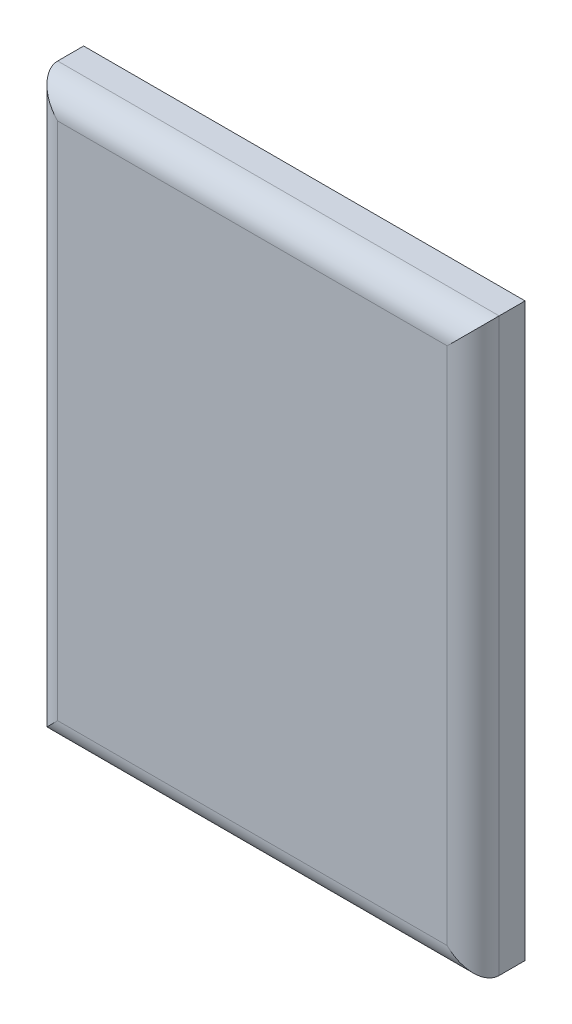
ISO-10303-21;
HEADER;
FILE_DESCRIPTION(('STEP AP214'),'2;1');
FILE_NAME('part.step','',(''),(''),'','','');
FILE_SCHEMA(('AUTOMOTIVE_DESIGN { 1 0 10303 214 1 1 1 1 }'));
ENDSEC;
DATA;
#1=APPLICATION_CONTEXT('core data for automotive mechanical design processes');
#2=APPLICATION_PROTOCOL_DEFINITION('international standard','automotive_design',2000,#1);
#3=PRODUCT_CONTEXT('',#1,'mechanical');
#4=PRODUCT('Part','Part','',(#3));
#5=PRODUCT_RELATED_PRODUCT_CATEGORY('part','',(#4));
#6=PRODUCT_DEFINITION_FORMATION('','',#4);
#7=PRODUCT_DEFINITION_CONTEXT('part definition',#1,'design');
#8=PRODUCT_DEFINITION('design','',#6,#7);
#9=PRODUCT_DEFINITION_SHAPE('','',#8);
#10=(LENGTH_UNIT() NAMED_UNIT(*) SI_UNIT(.MILLI.,.METRE.));
#11=(NAMED_UNIT(*) PLANE_ANGLE_UNIT() SI_UNIT($,.RADIAN.));
#12=(NAMED_UNIT(*) SI_UNIT($,.STERADIAN.) SOLID_ANGLE_UNIT());
#13=UNCERTAINTY_MEASURE_WITH_UNIT(LENGTH_MEASURE(1.E-05),#10,'distance_accuracy_value','');
#14=(GEOMETRIC_REPRESENTATION_CONTEXT(3) GLOBAL_UNCERTAINTY_ASSIGNED_CONTEXT((#13)) GLOBAL_UNIT_ASSIGNED_CONTEXT((#10,
#11,#12)) REPRESENTATION_CONTEXT('',''));
#15=CARTESIAN_POINT('',(0.,0.,0.));
#16=DIRECTION('',(0.,0.,1.));
#17=DIRECTION('',(1.,0.,0.));
#18=AXIS2_PLACEMENT_3D('',#15,#16,#17);
#19=CARTESIAN_POINT('',(-51.3297872340426,189.813829787234,50.));
#20=DIRECTION('',(1.,0.,0.));
#21=DIRECTION('',(0.,1.,0.));
#22=AXIS2_PLACEMENT_3D('',#19,#20,#21);
#23=PLANE('',#22);
#24=DIRECTION('',(0.,-1.,0.));
#25=VECTOR('',#24,1.);
#26=CARTESIAN_POINT('',(-51.3297872340426,189.813829787234,30.));
#27=LINE('',#26,#25);
#28=CARTESIAN_POINT('',(-51.3297872340426,189.813829787234,30.));
#29=VERTEX_POINT('',#28);
#30=CARTESIAN_POINT('',(-51.3297872340426,-30.186170212766,30.));
#31=VERTEX_POINT('',#30);
#32=EDGE_CURVE('E65',#29,#31,#27,.T.);
#33=ORIENTED_EDGE('',*,*,#32,.T.);
#34=DIRECTION('',(0.,0.,-1.));
#35=VECTOR('',#34,1.);
#36=CARTESIAN_POINT('',(-51.3297872340426,-30.186170212766,50.));
#37=LINE('',#36,#35);
#38=CARTESIAN_POINT('',(-51.3297872340426,-30.186170212766,40.));
#39=VERTEX_POINT('',#38);
#40=EDGE_CURVE('E144',#39,#31,#37,.T.);
#41=ORIENTED_EDGE('',*,*,#40,.F.);
#42=DIRECTION('',(0.,-1.,0.));
#43=VECTOR('',#42,1.);
#44=CARTESIAN_POINT('',(-51.3297872340426,189.813829787234,40.));
#45=LINE('',#44,#43);
#46=CARTESIAN_POINT('',(-51.3297872340426,189.813829787234,40.));
#47=VERTEX_POINT('',#46);
#48=EDGE_CURVE('E11',#39,#47,#45,.F.);
#49=ORIENTED_EDGE('',*,*,#48,.T.);
#50=DIRECTION('',(0.,0.,-1.));
#51=VECTOR('',#50,1.);
#52=CARTESIAN_POINT('',(-51.3297872340426,189.813829787234,50.));
#53=LINE('',#52,#51);
#54=EDGE_CURVE('E140',#47,#29,#53,.T.);
#55=ORIENTED_EDGE('',*,*,#54,.T.);
#56=EDGE_LOOP('',(#33,#41,#49,#55));
#57=FACE_BOUND('',#56,.T.);
#58=ADVANCED_FACE('F39',(#57),#23,.F.);
#59=CARTESIAN_POINT('',(-51.3297872340426,-30.186170212766,50.));
#60=DIRECTION('',(0.,1.,0.));
#61=DIRECTION('',(-1.,0.,0.));
#62=AXIS2_PLACEMENT_3D('',#59,#60,#61);
#63=PLANE('',#62);
#64=DIRECTION('',(1.,0.,0.));
#65=VECTOR('',#64,1.);
#66=CARTESIAN_POINT('',(118.670212765957,-30.186170212766,30.));
#67=LINE('',#66,#65);
#68=CARTESIAN_POINT('',(118.670212765957,-30.186170212766,30.));
#69=VERTEX_POINT('',#68);
#70=EDGE_CURVE('E201',#31,#69,#67,.T.);
#71=ORIENTED_EDGE('',*,*,#70,.T.);
#72=DIRECTION('',(0.,0.,-1.));
#73=VECTOR('',#72,1.);
#74=CARTESIAN_POINT('',(118.670212765957,-30.186170212766,50.));
#75=LINE('',#74,#73);
#76=CARTESIAN_POINT('',(118.670212765957,-30.186170212766,40.));
#77=VERTEX_POINT('',#76);
#78=EDGE_CURVE('E132',#77,#69,#75,.T.);
#79=ORIENTED_EDGE('',*,*,#78,.F.);
#80=DIRECTION('',(1.,0.,0.));
#81=VECTOR('',#80,1.);
#82=CARTESIAN_POINT('',(-51.3297872340426,-30.186170212766,40.));
#83=LINE('',#82,#81);
#84=EDGE_CURVE('E49',#77,#39,#83,.F.);
#85=ORIENTED_EDGE('',*,*,#84,.T.);
#86=ORIENTED_EDGE('',*,*,#40,.T.);
#87=EDGE_LOOP('',(#71,#79,#85,#86));
#88=FACE_BOUND('',#87,.T.);
#89=ADVANCED_FACE('F198',(#88),#63,.F.);
#90=CARTESIAN_POINT('',(118.670212765957,189.813829787234,50.));
#91=DIRECTION('',(-1.,0.,0.));
#92=DIRECTION('',(0.,-1.,0.));
#93=AXIS2_PLACEMENT_3D('',#90,#91,#92);
#94=PLANE('',#93);
#95=DIRECTION('',(0.,1.,0.));
#96=VECTOR('',#95,1.);
#97=CARTESIAN_POINT('',(118.670212765957,189.813829787234,30.));
#98=LINE('',#97,#96);
#99=CARTESIAN_POINT('',(118.670212765957,189.813829787234,30.));
#100=VERTEX_POINT('',#99);
#101=EDGE_CURVE('E118',#69,#100,#98,.T.);
#102=ORIENTED_EDGE('',*,*,#101,.T.);
#103=DIRECTION('',(0.,0.,-1.));
#104=VECTOR('',#103,1.);
#105=CARTESIAN_POINT('',(118.670212765957,189.813829787234,50.));
#106=LINE('',#105,#104);
#107=CARTESIAN_POINT('',(118.670212765957,189.813829787234,40.));
#108=VERTEX_POINT('',#107);
#109=EDGE_CURVE('E130',#108,#100,#106,.T.);
#110=ORIENTED_EDGE('',*,*,#109,.F.);
#111=DIRECTION('',(0.,1.,0.));
#112=VECTOR('',#111,1.);
#113=CARTESIAN_POINT('',(118.670212765957,-30.186170212766,40.));
#114=LINE('',#113,#112);
#115=EDGE_CURVE('E170',#108,#77,#114,.F.);
#116=ORIENTED_EDGE('',*,*,#115,.T.);
#117=ORIENTED_EDGE('',*,*,#78,.T.);
#118=EDGE_LOOP('',(#102,#110,#116,#117));
#119=FACE_BOUND('',#118,.T.);
#120=ADVANCED_FACE('F129',(#119),#94,.F.);
#121=CARTESIAN_POINT('',(-51.3297872340426,189.813829787234,50.));
#122=DIRECTION('',(0.,-1.,0.));
#123=DIRECTION('',(0.,0.,-1.));
#124=AXIS2_PLACEMENT_3D('',#121,#122,#123);
#125=PLANE('',#124);
#126=DIRECTION('',(-1.,0.,0.));
#127=VECTOR('',#126,1.);
#128=CARTESIAN_POINT('',(118.670212765957,189.813829787234,30.));
#129=LINE('',#128,#127);
#130=EDGE_CURVE('E115',#100,#29,#129,.T.);
#131=ORIENTED_EDGE('',*,*,#130,.T.);
#132=ORIENTED_EDGE('',*,*,#54,.F.);
#133=DIRECTION('',(-1.,0.,0.));
#134=VECTOR('',#133,1.);
#135=CARTESIAN_POINT('',(118.670212765957,189.813829787234,40.));
#136=LINE('',#135,#134);
#137=EDGE_CURVE('E138',#47,#108,#136,.F.);
#138=ORIENTED_EDGE('',*,*,#137,.T.);
#139=ORIENTED_EDGE('',*,*,#109,.T.);
#140=EDGE_LOOP('',(#131,#132,#138,#139));
#141=FACE_BOUND('',#140,.T.);
#142=ADVANCED_FACE('F136',(#141),#125,.F.);
#143=CARTESIAN_POINT('',(0.,-20.186170212766,40.));
#144=DIRECTION('',(-1.,0.,0.));
#145=DIRECTION('',(0.,-1.,0.));
#146=AXIS2_PLACEMENT_3D('',#143,#144,#145);
#147=CYLINDRICAL_SURFACE('',#146,10.);
#148=CARTESIAN_POINT('',(-41.3297872340426,-20.186170212766,40.));
#149=DIRECTION('',(-0.707106781186547,0.707106781186547,0.));
#150=DIRECTION('',(0.707106781186547,0.707106781186548,0.));
#151=AXIS2_PLACEMENT_3D('',#148,#149,#150);
#152=ELLIPSE('',#151,14.1421356237309,10.);
#153=CARTESIAN_POINT('',(-41.3297872340426,-20.186170212766,50.));
#154=VERTEX_POINT('',#153);
#155=EDGE_CURVE('E182',#39,#154,#152,.T.);
#156=ORIENTED_EDGE('',*,*,#155,.F.);
#157=ORIENTED_EDGE('',*,*,#84,.F.);
#158=CARTESIAN_POINT('',(108.670212765957,-20.186170212766,40.));
#159=DIRECTION('',(-0.707106781186547,-0.707106781186548,0.));
#160=DIRECTION('',(-0.707106781186547,0.707106781186547,0.));
#161=AXIS2_PLACEMENT_3D('',#158,#159,#160);
#162=ELLIPSE('',#161,14.1421356237309,10.);
#163=CARTESIAN_POINT('',(108.670212765957,-20.186170212766,50.));
#164=VERTEX_POINT('',#163);
#165=EDGE_CURVE('E43',#164,#77,#162,.F.);
#166=ORIENTED_EDGE('',*,*,#165,.F.);
#167=DIRECTION('',(1.,0.,0.));
#168=VECTOR('',#167,1.);
#169=CARTESIAN_POINT('',(118.670212765957,-20.186170212766,50.));
#170=LINE('',#169,#168);
#171=EDGE_CURVE('E156',#154,#164,#170,.T.);
#172=ORIENTED_EDGE('',*,*,#171,.F.);
#173=EDGE_LOOP('',(#156,#157,#166,#172));
#174=FACE_BOUND('',#173,.T.);
#175=ADVANCED_FACE('F41',(#174),#147,.T.);
#176=CARTESIAN_POINT('',(108.670212765957,0.,40.));
#177=DIRECTION('',(0.,-1.,0.));
#178=DIRECTION('',(1.,0.,0.));
#179=AXIS2_PLACEMENT_3D('',#176,#177,#178);
#180=CYLINDRICAL_SURFACE('',#179,10.);
#181=ORIENTED_EDGE('',*,*,#165,.T.);
#182=ORIENTED_EDGE('',*,*,#115,.F.);
#183=CARTESIAN_POINT('',(108.670212765957,179.813829787234,40.));
#184=DIRECTION('',(0.707106781186547,-0.707106781186547,0.));
#185=DIRECTION('',(-0.707106781186547,-0.707106781186548,0.));
#186=AXIS2_PLACEMENT_3D('',#183,#184,#185);
#187=ELLIPSE('',#186,14.1421356237309,10.);
#188=CARTESIAN_POINT('',(108.670212765957,179.813829787234,50.));
#189=VERTEX_POINT('',#188);
#190=EDGE_CURVE('E179',#189,#108,#187,.F.);
#191=ORIENTED_EDGE('',*,*,#190,.F.);
#192=DIRECTION('',(0.,1.,0.));
#193=VECTOR('',#192,1.);
#194=CARTESIAN_POINT('',(108.670212765957,189.813829787234,50.));
#195=LINE('',#194,#193);
#196=EDGE_CURVE('E160',#164,#189,#195,.T.);
#197=ORIENTED_EDGE('',*,*,#196,.F.);
#198=EDGE_LOOP('',(#181,#182,#191,#197));
#199=FACE_BOUND('',#198,.T.);
#200=ADVANCED_FACE('F193',(#199),#180,.T.);
#201=CARTESIAN_POINT('',(-41.3297872340426,0.,40.));
#202=DIRECTION('',(0.,1.,0.));
#203=DIRECTION('',(-1.,0.,0.));
#204=AXIS2_PLACEMENT_3D('',#201,#202,#203);
#205=CYLINDRICAL_SURFACE('',#204,10.);
#206=ORIENTED_EDGE('',*,*,#155,.T.);
#207=DIRECTION('',(0.,-1.,0.));
#208=VECTOR('',#207,1.);
#209=CARTESIAN_POINT('',(-41.3297872340426,-30.186170212766,50.));
#210=LINE('',#209,#208);
#211=CARTESIAN_POINT('',(-41.3297872340426,179.813829787234,50.));
#212=VERTEX_POINT('',#211);
#213=EDGE_CURVE('E152',#212,#154,#210,.T.);
#214=ORIENTED_EDGE('',*,*,#213,.F.);
#215=CARTESIAN_POINT('',(-41.3297872340426,179.813829787234,40.));
#216=DIRECTION('',(0.707106781186547,0.707106781186548,0.));
#217=DIRECTION('',(-0.707106781186547,0.707106781186547,0.));
#218=AXIS2_PLACEMENT_3D('',#215,#216,#217);
#219=ELLIPSE('',#218,14.142135623731,10.);
#220=EDGE_CURVE('E175',#47,#212,#219,.T.);
#221=ORIENTED_EDGE('',*,*,#220,.F.);
#222=ORIENTED_EDGE('',*,*,#48,.F.);
#223=EDGE_LOOP('',(#206,#214,#221,#222));
#224=FACE_BOUND('',#223,.T.);
#225=ADVANCED_FACE('F282',(#224),#205,.T.);
#226=CARTESIAN_POINT('',(0.,179.813829787234,40.));
#227=DIRECTION('',(1.,0.,0.));
#228=DIRECTION('',(0.,0.,-1.));
#229=AXIS2_PLACEMENT_3D('',#226,#227,#228);
#230=CYLINDRICAL_SURFACE('',#229,10.);
#231=ORIENTED_EDGE('',*,*,#190,.T.);
#232=ORIENTED_EDGE('',*,*,#137,.F.);
#233=ORIENTED_EDGE('',*,*,#220,.T.);
#234=DIRECTION('',(-1.,0.,0.));
#235=VECTOR('',#234,1.);
#236=CARTESIAN_POINT('',(-51.3297872340426,179.813829787234,50.));
#237=LINE('',#236,#235);
#238=EDGE_CURVE('E164',#189,#212,#237,.T.);
#239=ORIENTED_EDGE('',*,*,#238,.F.);
#240=EDGE_LOOP('',(#231,#232,#233,#239));
#241=FACE_BOUND('',#240,.T.);
#242=ADVANCED_FACE('F278',(#241),#230,.T.);
#243=CARTESIAN_POINT('',(0.,0.,50.));
#244=DIRECTION('',(0.,0.,1.));
#245=DIRECTION('',(1.,0.,0.));
#246=AXIS2_PLACEMENT_3D('',#243,#244,#245);
#247=PLANE('',#246);
#248=ORIENTED_EDGE('',*,*,#213,.T.);
#249=ORIENTED_EDGE('',*,*,#171,.T.);
#250=ORIENTED_EDGE('',*,*,#196,.T.);
#251=ORIENTED_EDGE('',*,*,#238,.T.);
#252=EDGE_LOOP('',(#248,#249,#250,#251));
#253=FACE_BOUND('',#252,.T.);
#254=ADVANCED_FACE('F281',(#253),#247,.T.);
#255=CARTESIAN_POINT('',(0.,0.,30.));
#256=DIRECTION('',(0.,0.,-1.));
#257=DIRECTION('',(-1.,0.,0.));
#258=AXIS2_PLACEMENT_3D('',#255,#256,#257);
#259=PLANE('',#258);
#260=ORIENTED_EDGE('',*,*,#101,.F.);
#261=ORIENTED_EDGE('',*,*,#70,.F.);
#262=ORIENTED_EDGE('',*,*,#32,.F.);
#263=ORIENTED_EDGE('',*,*,#130,.F.);
#264=EDGE_LOOP('',(#260,#261,#262,#263));
#265=FACE_BOUND('',#264,.T.);
#266=DIRECTION('',(0.,-1.,0.));
#267=VECTOR('',#266,1.);
#268=CARTESIAN_POINT('',(-41.3297872340426,179.813829787234,30.));
#269=LINE('',#268,#267);
#270=CARTESIAN_POINT('',(-41.3297872340426,179.813829787234,30.));
#271=VERTEX_POINT('',#270);
#272=CARTESIAN_POINT('',(-41.3297872340426,-20.186170212766,30.));
#273=VERTEX_POINT('',#272);
#274=EDGE_CURVE('E214',#271,#273,#269,.T.);
#275=ORIENTED_EDGE('',*,*,#274,.T.);
#276=DIRECTION('',(1.,0.,0.));
#277=VECTOR('',#276,1.);
#278=CARTESIAN_POINT('',(-41.3297872340426,-20.186170212766,30.));
#279=LINE('',#278,#277);
#280=CARTESIAN_POINT('',(108.670212765957,-20.186170212766,30.));
#281=VERTEX_POINT('',#280);
#282=EDGE_CURVE('E211',#273,#281,#279,.T.);
#283=ORIENTED_EDGE('',*,*,#282,.T.);
#284=DIRECTION('',(0.,1.,0.));
#285=VECTOR('',#284,1.);
#286=CARTESIAN_POINT('',(108.670212765957,179.813829787234,30.));
#287=LINE('',#286,#285);
#288=CARTESIAN_POINT('',(108.670212765957,179.813829787234,30.));
#289=VERTEX_POINT('',#288);
#290=EDGE_CURVE('E57',#281,#289,#287,.T.);
#291=ORIENTED_EDGE('',*,*,#290,.T.);
#292=DIRECTION('',(-1.,0.,0.));
#293=VECTOR('',#292,1.);
#294=CARTESIAN_POINT('',(-41.3297872340426,179.813829787234,30.));
#295=LINE('',#294,#293);
#296=EDGE_CURVE('E204',#289,#271,#295,.T.);
#297=ORIENTED_EDGE('',*,*,#296,.T.);
#298=EDGE_LOOP('',(#275,#283,#291,#297));
#299=FACE_BOUND('',#298,.T.);
#300=ADVANCED_FACE('F117',(#265,#299),#259,.T.);
#301=CARTESIAN_POINT('',(0.,0.,40.));
#302=DIRECTION('',(0.,0.,1.));
#303=DIRECTION('',(1.,0.,0.));
#304=AXIS2_PLACEMENT_3D('',#301,#302,#303);
#305=PLANE('',#304);
#306=DIRECTION('',(0.,-1.,0.));
#307=VECTOR('',#306,1.);
#308=CARTESIAN_POINT('',(-41.3297872340426,179.813829787234,40.));
#309=LINE('',#308,#307);
#310=CARTESIAN_POINT('',(-41.3297872340426,179.813829787234,40.));
#311=VERTEX_POINT('',#310);
#312=CARTESIAN_POINT('',(-41.3297872340426,-20.186170212766,40.));
#313=VERTEX_POINT('',#312);
#314=EDGE_CURVE('E217',#311,#313,#309,.T.);
#315=ORIENTED_EDGE('',*,*,#314,.F.);
#316=DIRECTION('',(-1.,0.,0.));
#317=VECTOR('',#316,1.);
#318=CARTESIAN_POINT('',(-41.3297872340426,179.813829787234,40.));
#319=LINE('',#318,#317);
#320=CARTESIAN_POINT('',(108.670212765957,179.813829787234,40.));
#321=VERTEX_POINT('',#320);
#322=EDGE_CURVE('E227',#321,#311,#319,.T.);
#323=ORIENTED_EDGE('',*,*,#322,.F.);
#324=DIRECTION('',(0.,1.,0.));
#325=VECTOR('',#324,1.);
#326=CARTESIAN_POINT('',(108.670212765957,179.813829787234,40.));
#327=LINE('',#326,#325);
#328=CARTESIAN_POINT('',(108.670212765957,-20.186170212766,40.));
#329=VERTEX_POINT('',#328);
#330=EDGE_CURVE('E223',#329,#321,#327,.T.);
#331=ORIENTED_EDGE('',*,*,#330,.F.);
#332=DIRECTION('',(1.,0.,0.));
#333=VECTOR('',#332,1.);
#334=CARTESIAN_POINT('',(-41.3297872340426,-20.186170212766,40.));
#335=LINE('',#334,#333);
#336=EDGE_CURVE('E220',#313,#329,#335,.T.);
#337=ORIENTED_EDGE('',*,*,#336,.F.);
#338=EDGE_LOOP('',(#315,#323,#331,#337));
#339=FACE_BOUND('',#338,.T.);
#340=ADVANCED_FACE('F254',(#339),#305,.F.);
#341=CARTESIAN_POINT('',(-41.3297872340426,179.813829787234,50.));
#342=DIRECTION('',(0.,1.,0.));
#343=DIRECTION('',(-1.,0.,0.));
#344=AXIS2_PLACEMENT_3D('',#341,#342,#343);
#345=PLANE('',#344);
#346=ORIENTED_EDGE('',*,*,#296,.F.);
#347=DIRECTION('',(0.,0.,-1.));
#348=VECTOR('',#347,1.);
#349=CARTESIAN_POINT('',(108.670212765957,179.813829787234,50.));
#350=LINE('',#349,#348);
#351=EDGE_CURVE('E238',#321,#289,#350,.T.);
#352=ORIENTED_EDGE('',*,*,#351,.F.);
#353=ORIENTED_EDGE('',*,*,#322,.T.);
#354=DIRECTION('',(0.,0.,-1.));
#355=VECTOR('',#354,1.);
#356=CARTESIAN_POINT('',(-41.3297872340426,179.813829787234,50.));
#357=LINE('',#356,#355);
#358=EDGE_CURVE('E230',#311,#271,#357,.T.);
#359=ORIENTED_EDGE('',*,*,#358,.T.);
#360=EDGE_LOOP('',(#346,#352,#353,#359));
#361=FACE_BOUND('',#360,.T.);
#362=ADVANCED_FACE('F245',(#361),#345,.F.);
#363=CARTESIAN_POINT('',(108.670212765957,179.813829787234,50.));
#364=DIRECTION('',(1.,0.,0.));
#365=DIRECTION('',(0.,1.,0.));
#366=AXIS2_PLACEMENT_3D('',#363,#364,#365);
#367=PLANE('',#366);
#368=ORIENTED_EDGE('',*,*,#290,.F.);
#369=DIRECTION('',(0.,0.,-1.));
#370=VECTOR('',#369,1.);
#371=CARTESIAN_POINT('',(108.670212765957,-20.186170212766,50.));
#372=LINE('',#371,#370);
#373=EDGE_CURVE('E234',#329,#281,#372,.T.);
#374=ORIENTED_EDGE('',*,*,#373,.F.);
#375=ORIENTED_EDGE('',*,*,#330,.T.);
#376=ORIENTED_EDGE('',*,*,#351,.T.);
#377=EDGE_LOOP('',(#368,#374,#375,#376));
#378=FACE_BOUND('',#377,.T.);
#379=ADVANCED_FACE('F261',(#378),#367,.F.);
#380=CARTESIAN_POINT('',(-41.3297872340426,-20.186170212766,50.));
#381=DIRECTION('',(0.,-1.,0.));
#382=DIRECTION('',(1.,0.,0.));
#383=AXIS2_PLACEMENT_3D('',#380,#381,#382);
#384=PLANE('',#383);
#385=ORIENTED_EDGE('',*,*,#282,.F.);
#386=DIRECTION('',(0.,0.,-1.));
#387=VECTOR('',#386,1.);
#388=CARTESIAN_POINT('',(-41.3297872340426,-20.186170212766,50.));
#389=LINE('',#388,#387);
#390=EDGE_CURVE('E180',#313,#273,#389,.T.);
#391=ORIENTED_EDGE('',*,*,#390,.F.);
#392=ORIENTED_EDGE('',*,*,#336,.T.);
#393=ORIENTED_EDGE('',*,*,#373,.T.);
#394=EDGE_LOOP('',(#385,#391,#392,#393));
#395=FACE_BOUND('',#394,.T.);
#396=ADVANCED_FACE('F259',(#395),#384,.F.);
#397=CARTESIAN_POINT('',(-41.3297872340426,179.813829787234,50.));
#398=DIRECTION('',(-1.,0.,0.));
#399=DIRECTION('',(0.,-1.,0.));
#400=AXIS2_PLACEMENT_3D('',#397,#398,#399);
#401=PLANE('',#400);
#402=ORIENTED_EDGE('',*,*,#274,.F.);
#403=ORIENTED_EDGE('',*,*,#358,.F.);
#404=ORIENTED_EDGE('',*,*,#314,.T.);
#405=ORIENTED_EDGE('',*,*,#390,.T.);
#406=EDGE_LOOP('',(#402,#403,#404,#405));
#407=FACE_BOUND('',#406,.T.);
#408=ADVANCED_FACE('F250',(#407),#401,.F.);
#409=CLOSED_SHELL('',(#58,#89,#120,#142,#175,#200,#225,#242,#254,#300,#340,#362,#379,#396,#408));
#410=MANIFOLD_SOLID_BREP('B2',#409);
#411=ADVANCED_BREP_SHAPE_REPRESENTATION('',(#18,#410),#14);
#412=SHAPE_DEFINITION_REPRESENTATION(#9,#411);
ENDSEC;
END-ISO-10303-21;
